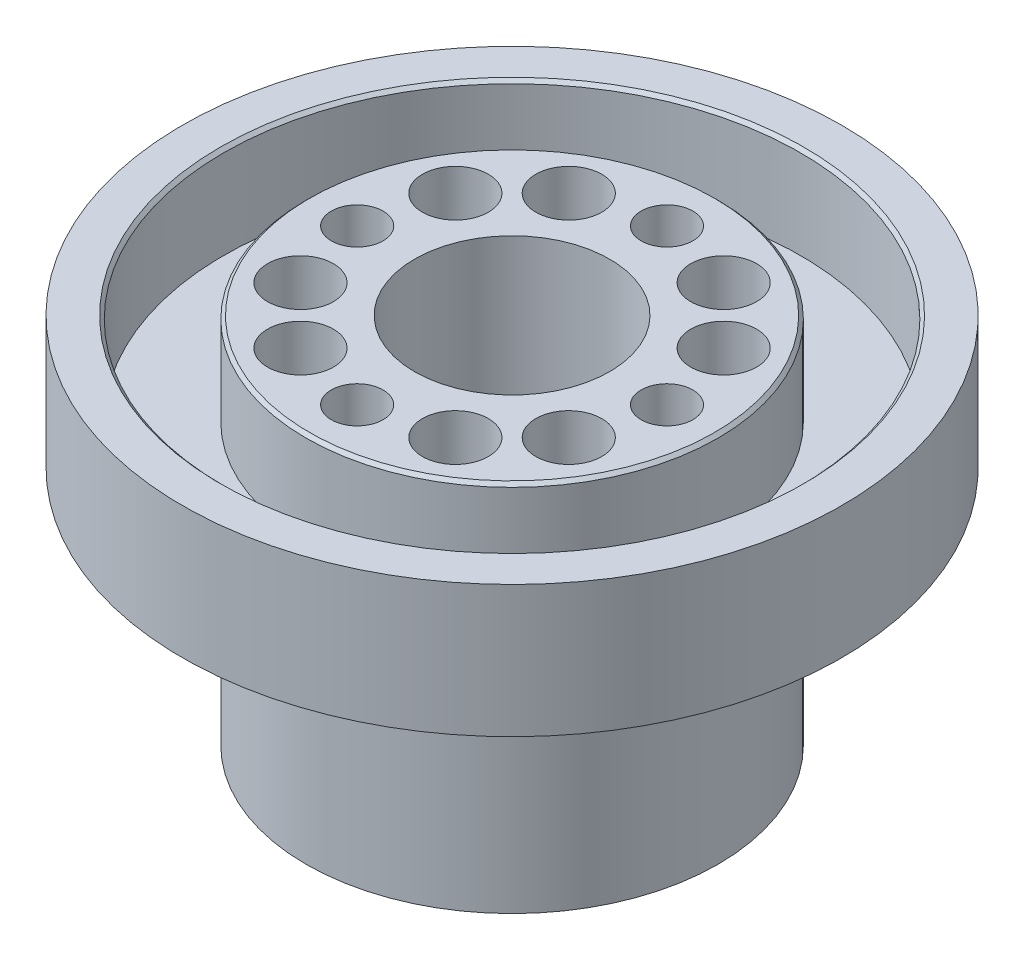
ISO-10303-21;
HEADER;
FILE_DESCRIPTION(('STEP AP214'),'2;1');
FILE_NAME('part.step','',(''),(''),'','','');
FILE_SCHEMA(('AUTOMOTIVE_DESIGN { 1 0 10303 214 1 1 1 1 }'));
ENDSEC;
DATA;
#1=APPLICATION_CONTEXT('core data for automotive mechanical design processes');
#2=APPLICATION_PROTOCOL_DEFINITION('international standard','automotive_design',2000,#1);
#3=PRODUCT_CONTEXT('',#1,'mechanical');
#4=PRODUCT('Part','Part','',(#3));
#5=PRODUCT_RELATED_PRODUCT_CATEGORY('part','',(#4));
#6=PRODUCT_DEFINITION_FORMATION('','',#4);
#7=PRODUCT_DEFINITION_CONTEXT('part definition',#1,'design');
#8=PRODUCT_DEFINITION('design','',#6,#7);
#9=PRODUCT_DEFINITION_SHAPE('','',#8);
#10=(LENGTH_UNIT() NAMED_UNIT(*) SI_UNIT(.MILLI.,.METRE.));
#11=(NAMED_UNIT(*) PLANE_ANGLE_UNIT() SI_UNIT($,.RADIAN.));
#12=(NAMED_UNIT(*) SI_UNIT($,.STERADIAN.) SOLID_ANGLE_UNIT());
#13=UNCERTAINTY_MEASURE_WITH_UNIT(LENGTH_MEASURE(1.E-05),#10,'distance_accuracy_value','');
#14=(GEOMETRIC_REPRESENTATION_CONTEXT(3) GLOBAL_UNCERTAINTY_ASSIGNED_CONTEXT((#13)) GLOBAL_UNIT_ASSIGNED_CONTEXT((#10,
#11,#12)) REPRESENTATION_CONTEXT('',''));
#15=CARTESIAN_POINT('',(0.,0.,0.));
#16=DIRECTION('',(0.,0.,1.));
#17=DIRECTION('',(1.,0.,0.));
#18=AXIS2_PLACEMENT_3D('',#15,#16,#17);
#19=CARTESIAN_POINT('',(0.,16.51,0.));
#20=DIRECTION('',(0.,1.,0.));
#21=DIRECTION('',(0.,0.,1.));
#22=AXIS2_PLACEMENT_3D('',#19,#20,#21);
#23=CYLINDRICAL_SURFACE('',#22,7.5184);
#24=CARTESIAN_POINT('',(0.,28.702,0.));
#25=DIRECTION('',(0.,1.,0.));
#26=DIRECTION('',(0.,0.,1.));
#27=AXIS2_PLACEMENT_3D('',#24,#25,#26);
#28=CIRCLE('',#27,7.5184);
#29=CARTESIAN_POINT('',(0.,28.702,7.5184));
#30=VERTEX_POINT('',#29);
#31=EDGE_CURVE('E131',#30,#30,#28,.F.);
#32=ORIENTED_EDGE('',*,*,#31,.F.);
#33=EDGE_LOOP('',(#32));
#34=FACE_BOUND('',#33,.T.);
#35=CARTESIAN_POINT('',(0.,16.51,0.));
#36=DIRECTION('',(0.,1.,0.));
#37=DIRECTION('',(0.,0.,1.));
#38=AXIS2_PLACEMENT_3D('',#35,#36,#37);
#39=CIRCLE('',#38,7.5184);
#40=CARTESIAN_POINT('',(0.,16.51,7.5184));
#41=VERTEX_POINT('',#40);
#42=EDGE_CURVE('E17',#41,#41,#39,.T.);
#43=ORIENTED_EDGE('',*,*,#42,.F.);
#44=EDGE_LOOP('',(#43));
#45=FACE_BOUND('',#44,.T.);
#46=ADVANCED_FACE('F14',(#34,#45),#23,.F.);
#47=CARTESIAN_POINT('',(0.,28.448,0.));
#48=DIRECTION('',(0.,-1.,0.));
#49=DIRECTION('',(0.,0.,-1.));
#50=AXIS2_PLACEMENT_3D('',#47,#48,#49);
#51=CONICAL_SURFACE('',#50,15.875,0.785398163397448);
#52=CARTESIAN_POINT('',(0.,28.702,0.));
#53=DIRECTION('',(0.,-1.,0.));
#54=DIRECTION('',(0.,0.,-1.));
#55=AXIS2_PLACEMENT_3D('',#52,#53,#54);
#56=CIRCLE('',#55,15.621);
#57=CARTESIAN_POINT('',(0.,28.702,-15.621));
#58=VERTEX_POINT('',#57);
#59=EDGE_CURVE('E133',#58,#58,#56,.F.);
#60=ORIENTED_EDGE('',*,*,#59,.F.);
#61=EDGE_LOOP('',(#60));
#62=FACE_BOUND('',#61,.T.);
#63=CARTESIAN_POINT('',(0.,28.448,0.));
#64=DIRECTION('',(0.,1.,0.));
#65=DIRECTION('',(0.,0.,1.));
#66=AXIS2_PLACEMENT_3D('',#63,#64,#65);
#67=CIRCLE('',#66,15.875);
#68=CARTESIAN_POINT('',(0.,28.448,15.875));
#69=VERTEX_POINT('',#68);
#70=EDGE_CURVE('E29',#69,#69,#67,.F.);
#71=ORIENTED_EDGE('',*,*,#70,.F.);
#72=EDGE_LOOP('',(#71));
#73=FACE_BOUND('',#72,.T.);
#74=ADVANCED_FACE('F144',(#62,#73),#51,.T.);
#75=CARTESIAN_POINT('',(0.,16.51,0.));
#76=DIRECTION('',(0.,1.,0.));
#77=DIRECTION('',(0.,0.,1.));
#78=AXIS2_PLACEMENT_3D('',#75,#76,#77);
#79=PLANE('',#78);
#80=ORIENTED_EDGE('',*,*,#42,.T.);
#81=EDGE_LOOP('',(#80));
#82=FACE_BOUND('',#81,.T.);
#83=CARTESIAN_POINT('',(0.,16.51,0.));
#84=DIRECTION('',(0.,-1.,0.));
#85=DIRECTION('',(0.,0.,-1.));
#86=AXIS2_PLACEMENT_3D('',#83,#84,#85);
#87=CIRCLE('',#86,6.985);
#88=CARTESIAN_POINT('',(0.,16.51,-6.985));
#89=VERTEX_POINT('',#88);
#90=EDGE_CURVE('E104',#89,#89,#87,.T.);
#91=ORIENTED_EDGE('',*,*,#90,.T.);
#92=EDGE_LOOP('',(#91));
#93=FACE_BOUND('',#92,.T.);
#94=ADVANCED_FACE('F140',(#82,#93),#79,.T.);
#95=CARTESIAN_POINT('',(0.,28.702,0.));
#96=DIRECTION('',(0.,1.,0.));
#97=DIRECTION('',(0.,0.,1.));
#98=AXIS2_PLACEMENT_3D('',#95,#96,#97);
#99=PLANE('',#98);
#100=CARTESIAN_POINT('',(-10.3386112703787,28.702,5.96899999999994));
#101=DIRECTION('',(0.,-1.,0.));
#102=DIRECTION('',(0.,0.,-1.));
#103=AXIS2_PLACEMENT_3D('',#100,#101,#102);
#104=CIRCLE('',#103,2.54);
#105=CARTESIAN_POINT('',(-10.3386112703787,28.702,3.42899999999993));
#106=VERTEX_POINT('',#105);
#107=EDGE_CURVE('E128',#106,#106,#104,.T.);
#108=ORIENTED_EDGE('',*,*,#107,.T.);
#109=EDGE_LOOP('',(#108));
#110=FACE_BOUND('',#109,.T.);
#111=CARTESIAN_POINT('',(-5.96900000000012,28.702,10.3386112703786));
#112=DIRECTION('',(0.,-1.,0.));
#113=DIRECTION('',(0.,0.,-1.));
#114=AXIS2_PLACEMENT_3D('',#111,#112,#113);
#115=CIRCLE('',#114,2.54);
#116=CARTESIAN_POINT('',(-5.96900000000012,28.702,7.79861127037856));
#117=VERTEX_POINT('',#116);
#118=EDGE_CURVE('E125',#117,#117,#115,.T.);
#119=ORIENTED_EDGE('',*,*,#118,.T.);
#120=EDGE_LOOP('',(#119));
#121=FACE_BOUND('',#120,.T.);
#122=CARTESIAN_POINT('',(5.96900000000004,28.702,10.3386112703786));
#123=DIRECTION('',(0.,-1.,0.));
#124=DIRECTION('',(0.,0.,-1.));
#125=AXIS2_PLACEMENT_3D('',#122,#123,#124);
#126=CIRCLE('',#125,2.54);
#127=CARTESIAN_POINT('',(5.96900000000004,28.702,7.7986112703786));
#128=VERTEX_POINT('',#127);
#129=EDGE_CURVE('E122',#128,#128,#126,.T.);
#130=ORIENTED_EDGE('',*,*,#129,.T.);
#131=EDGE_LOOP('',(#130));
#132=FACE_BOUND('',#131,.T.);
#133=CARTESIAN_POINT('',(10.3386112703786,28.702,5.96900000000002));
#134=DIRECTION('',(0.,-1.,0.));
#135=DIRECTION('',(0.,0.,-1.));
#136=AXIS2_PLACEMENT_3D('',#133,#134,#135);
#137=CIRCLE('',#136,2.54);
#138=CARTESIAN_POINT('',(10.3386112703786,28.702,3.42900000000001));
#139=VERTEX_POINT('',#138);
#140=EDGE_CURVE('E119',#139,#139,#137,.T.);
#141=ORIENTED_EDGE('',*,*,#140,.T.);
#142=EDGE_LOOP('',(#141));
#143=FACE_BOUND('',#142,.T.);
#144=CARTESIAN_POINT('',(10.3386112703786,28.702,-5.96900000000001));
#145=DIRECTION('',(0.,-1.,0.));
#146=DIRECTION('',(0.,0.,-1.));
#147=AXIS2_PLACEMENT_3D('',#144,#145,#146);
#148=CIRCLE('',#147,2.54);
#149=CARTESIAN_POINT('',(10.3386112703786,28.702,-8.50900000000001));
#150=VERTEX_POINT('',#149);
#151=EDGE_CURVE('E116',#150,#150,#148,.T.);
#152=ORIENTED_EDGE('',*,*,#151,.T.);
#153=EDGE_LOOP('',(#152));
#154=FACE_BOUND('',#153,.T.);
#155=CARTESIAN_POINT('',(5.96900000000005,28.702,-10.3386112703786));
#156=DIRECTION('',(0.,-1.,0.));
#157=DIRECTION('',(0.,0.,-1.));
#158=AXIS2_PLACEMENT_3D('',#155,#156,#157);
#159=CIRCLE('',#158,2.54);
#160=CARTESIAN_POINT('',(5.96900000000005,28.702,-12.8786112703786));
#161=VERTEX_POINT('',#160);
#162=EDGE_CURVE('E113',#161,#161,#159,.T.);
#163=ORIENTED_EDGE('',*,*,#162,.T.);
#164=EDGE_LOOP('',(#163));
#165=FACE_BOUND('',#164,.T.);
#166=CARTESIAN_POINT('',(-5.96900000000004,28.702,-10.3386112703786));
#167=DIRECTION('',(0.,-1.,0.));
#168=DIRECTION('',(0.,0.,-1.));
#169=AXIS2_PLACEMENT_3D('',#166,#167,#168);
#170=CIRCLE('',#169,2.54);
#171=CARTESIAN_POINT('',(-5.96900000000004,28.702,-12.8786112703786));
#172=VERTEX_POINT('',#171);
#173=EDGE_CURVE('E110',#172,#172,#170,.T.);
#174=ORIENTED_EDGE('',*,*,#173,.T.);
#175=EDGE_LOOP('',(#174));
#176=FACE_BOUND('',#175,.T.);
#177=CARTESIAN_POINT('',(-10.3386112703786,28.702,-5.96900000000002));
#178=DIRECTION('',(0.,-1.,0.));
#179=DIRECTION('',(0.,0.,-1.));
#180=AXIS2_PLACEMENT_3D('',#177,#178,#179);
#181=CIRCLE('',#180,2.54);
#182=CARTESIAN_POINT('',(-10.3386112703786,28.702,-8.50900000000002));
#183=VERTEX_POINT('',#182);
#184=EDGE_CURVE('E107',#183,#183,#181,.T.);
#185=ORIENTED_EDGE('',*,*,#184,.T.);
#186=EDGE_LOOP('',(#185));
#187=FACE_BOUND('',#186,.T.);
#188=ORIENTED_EDGE('',*,*,#31,.T.);
#189=EDGE_LOOP('',(#188));
#190=FACE_BOUND('',#189,.T.);
#191=CARTESIAN_POINT('',(-11.938,28.702,-1.25043912669328E-13));
#192=DIRECTION('',(0.,1.,0.));
#193=DIRECTION('',(0.,0.,1.));
#194=AXIS2_PLACEMENT_3D('',#191,#192,#193);
#195=CIRCLE('',#194,1.9939);
#196=CARTESIAN_POINT('',(-11.938,28.702,1.99389999999988));
#197=VERTEX_POINT('',#196);
#198=EDGE_CURVE('E92',#197,#197,#195,.F.);
#199=ORIENTED_EDGE('',*,*,#198,.T.);
#200=EDGE_LOOP('',(#199));
#201=FACE_BOUND('',#200,.T.);
#202=CARTESIAN_POINT('',(0.,28.702,11.938));
#203=DIRECTION('',(0.,1.,0.));
#204=DIRECTION('',(0.,0.,1.));
#205=AXIS2_PLACEMENT_3D('',#202,#203,#204);
#206=CIRCLE('',#205,1.9939);
#207=CARTESIAN_POINT('',(0.,28.702,13.9319));
#208=VERTEX_POINT('',#207);
#209=EDGE_CURVE('E95',#208,#208,#206,.F.);
#210=ORIENTED_EDGE('',*,*,#209,.T.);
#211=EDGE_LOOP('',(#210));
#212=FACE_BOUND('',#211,.T.);
#213=CARTESIAN_POINT('',(11.938,28.702,0.));
#214=DIRECTION('',(0.,1.,0.));
#215=DIRECTION('',(0.,0.,1.));
#216=AXIS2_PLACEMENT_3D('',#213,#214,#215);
#217=CIRCLE('',#216,1.9939);
#218=CARTESIAN_POINT('',(11.938,28.702,1.99390000000004));
#219=VERTEX_POINT('',#218);
#220=EDGE_CURVE('E98',#219,#219,#217,.F.);
#221=ORIENTED_EDGE('',*,*,#220,.T.);
#222=EDGE_LOOP('',(#221));
#223=FACE_BOUND('',#222,.T.);
#224=CARTESIAN_POINT('',(0.,28.702,-11.938));
#225=DIRECTION('',(0.,1.,0.));
#226=DIRECTION('',(0.,0.,1.));
#227=AXIS2_PLACEMENT_3D('',#224,#225,#226);
#228=CIRCLE('',#227,1.9939);
#229=CARTESIAN_POINT('',(0.,28.702,-9.9441));
#230=VERTEX_POINT('',#229);
#231=EDGE_CURVE('E101',#230,#230,#228,.F.);
#232=ORIENTED_EDGE('',*,*,#231,.T.);
#233=EDGE_LOOP('',(#232));
#234=FACE_BOUND('',#233,.T.);
#235=ORIENTED_EDGE('',*,*,#59,.T.);
#236=EDGE_LOOP('',(#235));
#237=FACE_BOUND('',#236,.T.);
#238=ADVANCED_FACE('F251',(#110,#121,#132,#143,#154,#165,#176,#187,#190,#201,#212,#223,#234,
#237),#99,.T.);
#239=CARTESIAN_POINT('',(0.,21.59,0.));
#240=DIRECTION('',(0.,1.,0.));
#241=DIRECTION('',(0.,0.,1.));
#242=AXIS2_PLACEMENT_3D('',#239,#240,#241);
#243=CYLINDRICAL_SURFACE('',#242,15.875);
#244=CARTESIAN_POINT('',(0.,21.59,0.));
#245=DIRECTION('',(0.,1.,0.));
#246=DIRECTION('',(0.,0.,1.));
#247=AXIS2_PLACEMENT_3D('',#244,#245,#246);
#248=CIRCLE('',#247,15.875);
#249=CARTESIAN_POINT('',(0.,21.59,15.875));
#250=VERTEX_POINT('',#249);
#251=EDGE_CURVE('E89',#250,#250,#248,.F.);
#252=ORIENTED_EDGE('',*,*,#251,.F.);
#253=EDGE_LOOP('',(#252));
#254=FACE_BOUND('',#253,.T.);
#255=ORIENTED_EDGE('',*,*,#70,.T.);
#256=EDGE_LOOP('',(#255));
#257=FACE_BOUND('',#256,.T.);
#258=ADVANCED_FACE('F247',(#254,#257),#243,.T.);
#259=CARTESIAN_POINT('',(-10.3386112703787,28.702,5.96899999999994));
#260=DIRECTION('',(0.,-1.,0.));
#261=DIRECTION('',(0.,0.,-1.));
#262=AXIS2_PLACEMENT_3D('',#259,#260,#261);
#263=CYLINDRICAL_SURFACE('',#262,2.54);
#264=ORIENTED_EDGE('',*,*,#107,.F.);
#265=EDGE_LOOP('',(#264));
#266=FACE_BOUND('',#265,.T.);
#267=CARTESIAN_POINT('',(-10.3386112703787,0.,5.96899999999994));
#268=DIRECTION('',(0.,-1.,0.));
#269=DIRECTION('',(0.,0.,-1.));
#270=AXIS2_PLACEMENT_3D('',#267,#268,#269);
#271=CIRCLE('',#270,2.54);
#272=CARTESIAN_POINT('',(-10.3386112703787,0.,3.42899999999993));
#273=VERTEX_POINT('',#272);
#274=EDGE_CURVE('E86',#273,#273,#271,.T.);
#275=ORIENTED_EDGE('',*,*,#274,.T.);
#276=EDGE_LOOP('',(#275));
#277=FACE_BOUND('',#276,.T.);
#278=ADVANCED_FACE('F243',(#266,#277),#263,.F.);
#279=CARTESIAN_POINT('',(-5.96900000000012,28.702,10.3386112703786));
#280=DIRECTION('',(0.,-1.,0.));
#281=DIRECTION('',(0.,0.,-1.));
#282=AXIS2_PLACEMENT_3D('',#279,#280,#281);
#283=CYLINDRICAL_SURFACE('',#282,2.54);
#284=ORIENTED_EDGE('',*,*,#118,.F.);
#285=EDGE_LOOP('',(#284));
#286=FACE_BOUND('',#285,.T.);
#287=CARTESIAN_POINT('',(-5.96900000000012,0.,10.3386112703786));
#288=DIRECTION('',(0.,-1.,0.));
#289=DIRECTION('',(0.,0.,-1.));
#290=AXIS2_PLACEMENT_3D('',#287,#288,#289);
#291=CIRCLE('',#290,2.54);
#292=CARTESIAN_POINT('',(-5.96900000000012,0.,7.79861127037856));
#293=VERTEX_POINT('',#292);
#294=EDGE_CURVE('E83',#293,#293,#291,.T.);
#295=ORIENTED_EDGE('',*,*,#294,.T.);
#296=EDGE_LOOP('',(#295));
#297=FACE_BOUND('',#296,.T.);
#298=ADVANCED_FACE('F239',(#286,#297),#283,.F.);
#299=CARTESIAN_POINT('',(5.96900000000004,28.702,10.3386112703786));
#300=DIRECTION('',(0.,-1.,0.));
#301=DIRECTION('',(0.,0.,-1.));
#302=AXIS2_PLACEMENT_3D('',#299,#300,#301);
#303=CYLINDRICAL_SURFACE('',#302,2.54);
#304=ORIENTED_EDGE('',*,*,#129,.F.);
#305=EDGE_LOOP('',(#304));
#306=FACE_BOUND('',#305,.T.);
#307=CARTESIAN_POINT('',(5.96900000000004,0.,10.3386112703786));
#308=DIRECTION('',(0.,-1.,0.));
#309=DIRECTION('',(0.,0.,-1.));
#310=AXIS2_PLACEMENT_3D('',#307,#308,#309);
#311=CIRCLE('',#310,2.54);
#312=CARTESIAN_POINT('',(5.96900000000004,0.,7.7986112703786));
#313=VERTEX_POINT('',#312);
#314=EDGE_CURVE('E80',#313,#313,#311,.T.);
#315=ORIENTED_EDGE('',*,*,#314,.T.);
#316=EDGE_LOOP('',(#315));
#317=FACE_BOUND('',#316,.T.);
#318=ADVANCED_FACE('F235',(#306,#317),#303,.F.);
#319=CARTESIAN_POINT('',(10.3386112703786,28.702,5.96900000000002));
#320=DIRECTION('',(0.,-1.,0.));
#321=DIRECTION('',(0.,0.,-1.));
#322=AXIS2_PLACEMENT_3D('',#319,#320,#321);
#323=CYLINDRICAL_SURFACE('',#322,2.54);
#324=ORIENTED_EDGE('',*,*,#140,.F.);
#325=EDGE_LOOP('',(#324));
#326=FACE_BOUND('',#325,.T.);
#327=CARTESIAN_POINT('',(10.3386112703786,0.,5.96900000000002));
#328=DIRECTION('',(0.,-1.,0.));
#329=DIRECTION('',(0.,0.,-1.));
#330=AXIS2_PLACEMENT_3D('',#327,#328,#329);
#331=CIRCLE('',#330,2.54);
#332=CARTESIAN_POINT('',(10.3386112703786,0.,3.42900000000001));
#333=VERTEX_POINT('',#332);
#334=EDGE_CURVE('E77',#333,#333,#331,.T.);
#335=ORIENTED_EDGE('',*,*,#334,.T.);
#336=EDGE_LOOP('',(#335));
#337=FACE_BOUND('',#336,.T.);
#338=ADVANCED_FACE('F231',(#326,#337),#323,.F.);
#339=CARTESIAN_POINT('',(10.3386112703786,28.702,-5.96900000000001));
#340=DIRECTION('',(0.,-1.,0.));
#341=DIRECTION('',(0.,0.,-1.));
#342=AXIS2_PLACEMENT_3D('',#339,#340,#341);
#343=CYLINDRICAL_SURFACE('',#342,2.54);
#344=ORIENTED_EDGE('',*,*,#151,.F.);
#345=EDGE_LOOP('',(#344));
#346=FACE_BOUND('',#345,.T.);
#347=CARTESIAN_POINT('',(10.3386112703786,0.,-5.96900000000001));
#348=DIRECTION('',(0.,-1.,0.));
#349=DIRECTION('',(0.,0.,-1.));
#350=AXIS2_PLACEMENT_3D('',#347,#348,#349);
#351=CIRCLE('',#350,2.54);
#352=CARTESIAN_POINT('',(10.3386112703786,0.,-8.50900000000001));
#353=VERTEX_POINT('',#352);
#354=EDGE_CURVE('E74',#353,#353,#351,.T.);
#355=ORIENTED_EDGE('',*,*,#354,.T.);
#356=EDGE_LOOP('',(#355));
#357=FACE_BOUND('',#356,.T.);
#358=ADVANCED_FACE('F227',(#346,#357),#343,.F.);
#359=CARTESIAN_POINT('',(5.96900000000005,28.702,-10.3386112703786));
#360=DIRECTION('',(0.,-1.,0.));
#361=DIRECTION('',(0.,0.,-1.));
#362=AXIS2_PLACEMENT_3D('',#359,#360,#361);
#363=CYLINDRICAL_SURFACE('',#362,2.54);
#364=ORIENTED_EDGE('',*,*,#162,.F.);
#365=EDGE_LOOP('',(#364));
#366=FACE_BOUND('',#365,.T.);
#367=CARTESIAN_POINT('',(5.96900000000005,0.,-10.3386112703786));
#368=DIRECTION('',(0.,-1.,0.));
#369=DIRECTION('',(0.,0.,-1.));
#370=AXIS2_PLACEMENT_3D('',#367,#368,#369);
#371=CIRCLE('',#370,2.54);
#372=CARTESIAN_POINT('',(5.96900000000005,0.,-12.8786112703786));
#373=VERTEX_POINT('',#372);
#374=EDGE_CURVE('E71',#373,#373,#371,.T.);
#375=ORIENTED_EDGE('',*,*,#374,.T.);
#376=EDGE_LOOP('',(#375));
#377=FACE_BOUND('',#376,.T.);
#378=ADVANCED_FACE('F223',(#366,#377),#363,.F.);
#379=CARTESIAN_POINT('',(-5.96900000000004,28.702,-10.3386112703786));
#380=DIRECTION('',(0.,-1.,0.));
#381=DIRECTION('',(0.,0.,-1.));
#382=AXIS2_PLACEMENT_3D('',#379,#380,#381);
#383=CYLINDRICAL_SURFACE('',#382,2.54);
#384=ORIENTED_EDGE('',*,*,#173,.F.);
#385=EDGE_LOOP('',(#384));
#386=FACE_BOUND('',#385,.T.);
#387=CARTESIAN_POINT('',(-5.96900000000004,0.,-10.3386112703786));
#388=DIRECTION('',(0.,-1.,0.));
#389=DIRECTION('',(0.,0.,-1.));
#390=AXIS2_PLACEMENT_3D('',#387,#388,#389);
#391=CIRCLE('',#390,2.54);
#392=CARTESIAN_POINT('',(-5.96900000000004,0.,-12.8786112703786));
#393=VERTEX_POINT('',#392);
#394=EDGE_CURVE('E68',#393,#393,#391,.T.);
#395=ORIENTED_EDGE('',*,*,#394,.T.);
#396=EDGE_LOOP('',(#395));
#397=FACE_BOUND('',#396,.T.);
#398=ADVANCED_FACE('F219',(#386,#397),#383,.F.);
#399=CARTESIAN_POINT('',(-10.3386112703786,28.702,-5.96900000000002));
#400=DIRECTION('',(0.,-1.,0.));
#401=DIRECTION('',(0.,0.,-1.));
#402=AXIS2_PLACEMENT_3D('',#399,#400,#401);
#403=CYLINDRICAL_SURFACE('',#402,2.54);
#404=ORIENTED_EDGE('',*,*,#184,.F.);
#405=EDGE_LOOP('',(#404));
#406=FACE_BOUND('',#405,.T.);
#407=CARTESIAN_POINT('',(-10.3386112703786,0.,-5.96900000000002));
#408=DIRECTION('',(0.,-1.,0.));
#409=DIRECTION('',(0.,0.,-1.));
#410=AXIS2_PLACEMENT_3D('',#407,#408,#409);
#411=CIRCLE('',#410,2.54);
#412=CARTESIAN_POINT('',(-10.3386112703786,0.,-8.50900000000002));
#413=VERTEX_POINT('',#412);
#414=EDGE_CURVE('E65',#413,#413,#411,.T.);
#415=ORIENTED_EDGE('',*,*,#414,.T.);
#416=EDGE_LOOP('',(#415));
#417=FACE_BOUND('',#416,.T.);
#418=ADVANCED_FACE('F215',(#406,#417),#403,.F.);
#419=CARTESIAN_POINT('',(0.,28.702,0.));
#420=DIRECTION('',(0.,-1.,0.));
#421=DIRECTION('',(0.,0.,-1.));
#422=AXIS2_PLACEMENT_3D('',#419,#420,#421);
#423=CYLINDRICAL_SURFACE('',#422,6.985);
#424=CARTESIAN_POINT('',(0.,0.,0.));
#425=DIRECTION('',(0.,-1.,0.));
#426=DIRECTION('',(0.,0.,-1.));
#427=AXIS2_PLACEMENT_3D('',#424,#425,#426);
#428=CIRCLE('',#427,6.985);
#429=CARTESIAN_POINT('',(0.,0.,-6.985));
#430=VERTEX_POINT('',#429);
#431=EDGE_CURVE('E62',#430,#430,#428,.T.);
#432=ORIENTED_EDGE('',*,*,#431,.T.);
#433=EDGE_LOOP('',(#432));
#434=FACE_BOUND('',#433,.T.);
#435=ORIENTED_EDGE('',*,*,#90,.F.);
#436=EDGE_LOOP('',(#435));
#437=FACE_BOUND('',#436,.T.);
#438=ADVANCED_FACE('F211',(#434,#437),#423,.F.);
#439=CARTESIAN_POINT('',(0.,0.,-11.938));
#440=DIRECTION('',(0.,1.,0.));
#441=DIRECTION('',(0.,0.,1.));
#442=AXIS2_PLACEMENT_3D('',#439,#440,#441);
#443=CYLINDRICAL_SURFACE('',#442,1.9939);
#444=CARTESIAN_POINT('',(0.,0.,-11.938));
#445=DIRECTION('',(0.,1.,0.));
#446=DIRECTION('',(0.,0.,1.));
#447=AXIS2_PLACEMENT_3D('',#444,#445,#446);
#448=CIRCLE('',#447,1.9939);
#449=CARTESIAN_POINT('',(0.,0.,-9.9441));
#450=VERTEX_POINT('',#449);
#451=EDGE_CURVE('E59',#450,#450,#448,.F.);
#452=ORIENTED_EDGE('',*,*,#451,.T.);
#453=EDGE_LOOP('',(#452));
#454=FACE_BOUND('',#453,.T.);
#455=ORIENTED_EDGE('',*,*,#231,.F.);
#456=EDGE_LOOP('',(#455));
#457=FACE_BOUND('',#456,.T.);
#458=ADVANCED_FACE('F207',(#454,#457),#443,.F.);
#459=CARTESIAN_POINT('',(11.938,0.,0.));
#460=DIRECTION('',(0.,1.,0.));
#461=DIRECTION('',(0.,0.,1.));
#462=AXIS2_PLACEMENT_3D('',#459,#460,#461);
#463=CYLINDRICAL_SURFACE('',#462,1.9939);
#464=CARTESIAN_POINT('',(11.938,0.,0.));
#465=DIRECTION('',(0.,1.,0.));
#466=DIRECTION('',(0.,0.,1.));
#467=AXIS2_PLACEMENT_3D('',#464,#465,#466);
#468=CIRCLE('',#467,1.9939);
#469=CARTESIAN_POINT('',(11.938,0.,1.99390000000004));
#470=VERTEX_POINT('',#469);
#471=EDGE_CURVE('E56',#470,#470,#468,.F.);
#472=ORIENTED_EDGE('',*,*,#471,.T.);
#473=EDGE_LOOP('',(#472));
#474=FACE_BOUND('',#473,.T.);
#475=ORIENTED_EDGE('',*,*,#220,.F.);
#476=EDGE_LOOP('',(#475));
#477=FACE_BOUND('',#476,.T.);
#478=ADVANCED_FACE('F203',(#474,#477),#463,.F.);
#479=CARTESIAN_POINT('',(0.,0.,11.938));
#480=DIRECTION('',(0.,1.,0.));
#481=DIRECTION('',(0.,0.,1.));
#482=AXIS2_PLACEMENT_3D('',#479,#480,#481);
#483=CYLINDRICAL_SURFACE('',#482,1.9939);
#484=CARTESIAN_POINT('',(0.,0.,11.938));
#485=DIRECTION('',(0.,1.,0.));
#486=DIRECTION('',(0.,0.,1.));
#487=AXIS2_PLACEMENT_3D('',#484,#485,#486);
#488=CIRCLE('',#487,1.9939);
#489=CARTESIAN_POINT('',(0.,0.,13.9319));
#490=VERTEX_POINT('',#489);
#491=EDGE_CURVE('E53',#490,#490,#488,.F.);
#492=ORIENTED_EDGE('',*,*,#491,.T.);
#493=EDGE_LOOP('',(#492));
#494=FACE_BOUND('',#493,.T.);
#495=ORIENTED_EDGE('',*,*,#209,.F.);
#496=EDGE_LOOP('',(#495));
#497=FACE_BOUND('',#496,.T.);
#498=ADVANCED_FACE('F199',(#494,#497),#483,.F.);
#499=CARTESIAN_POINT('',(-11.938,0.,-1.25043912669328E-13));
#500=DIRECTION('',(0.,1.,0.));
#501=DIRECTION('',(0.,0.,1.));
#502=AXIS2_PLACEMENT_3D('',#499,#500,#501);
#503=CYLINDRICAL_SURFACE('',#502,1.9939);
#504=CARTESIAN_POINT('',(-11.938,0.,-1.25043912669328E-13));
#505=DIRECTION('',(0.,1.,0.));
#506=DIRECTION('',(0.,0.,1.));
#507=AXIS2_PLACEMENT_3D('',#504,#505,#506);
#508=CIRCLE('',#507,1.9939);
#509=CARTESIAN_POINT('',(-11.938,0.,1.99389999999988));
#510=VERTEX_POINT('',#509);
#511=EDGE_CURVE('E50',#510,#510,#508,.F.);
#512=ORIENTED_EDGE('',*,*,#511,.T.);
#513=EDGE_LOOP('',(#512));
#514=FACE_BOUND('',#513,.T.);
#515=ORIENTED_EDGE('',*,*,#198,.F.);
#516=EDGE_LOOP('',(#515));
#517=FACE_BOUND('',#516,.T.);
#518=ADVANCED_FACE('F195',(#514,#517),#503,.F.);
#519=CARTESIAN_POINT('',(0.,21.59,0.));
#520=DIRECTION('',(0.,1.,0.));
#521=DIRECTION('',(0.,0.,1.));
#522=AXIS2_PLACEMENT_3D('',#519,#520,#521);
#523=PLANE('',#522);
#524=CARTESIAN_POINT('',(0.,21.59,0.));
#525=DIRECTION('',(0.,1.,0.));
#526=DIRECTION('',(0.,0.,1.));
#527=AXIS2_PLACEMENT_3D('',#524,#525,#526);
#528=CIRCLE('',#527,22.225);
#529=CARTESIAN_POINT('',(0.,21.59,22.225));
#530=VERTEX_POINT('',#529);
#531=EDGE_CURVE('E47',#530,#530,#528,.T.);
#532=ORIENTED_EDGE('',*,*,#531,.T.);
#533=EDGE_LOOP('',(#532));
#534=FACE_BOUND('',#533,.T.);
#535=ORIENTED_EDGE('',*,*,#251,.T.);
#536=EDGE_LOOP('',(#535));
#537=FACE_BOUND('',#536,.T.);
#538=ADVANCED_FACE('F191',(#534,#537),#523,.T.);
#539=CARTESIAN_POINT('',(0.,0.,0.));
#540=DIRECTION('',(0.,1.,0.));
#541=DIRECTION('',(0.,0.,1.));
#542=AXIS2_PLACEMENT_3D('',#539,#540,#541);
#543=PLANE('',#542);
#544=CARTESIAN_POINT('',(0.,0.,0.));
#545=DIRECTION('',(0.,-1.,0.));
#546=DIRECTION('',(0.,0.,-1.));
#547=AXIS2_PLACEMENT_3D('',#544,#545,#546);
#548=CIRCLE('',#547,15.875);
#549=CARTESIAN_POINT('',(0.,0.,-15.875));
#550=VERTEX_POINT('',#549);
#551=EDGE_CURVE('E44',#550,#550,#548,.F.);
#552=ORIENTED_EDGE('',*,*,#551,.F.);
#553=EDGE_LOOP('',(#552));
#554=FACE_BOUND('',#553,.T.);
#555=ORIENTED_EDGE('',*,*,#511,.F.);
#556=EDGE_LOOP('',(#555));
#557=FACE_BOUND('',#556,.T.);
#558=ORIENTED_EDGE('',*,*,#491,.F.);
#559=EDGE_LOOP('',(#558));
#560=FACE_BOUND('',#559,.T.);
#561=ORIENTED_EDGE('',*,*,#471,.F.);
#562=EDGE_LOOP('',(#561));
#563=FACE_BOUND('',#562,.T.);
#564=ORIENTED_EDGE('',*,*,#451,.F.);
#565=EDGE_LOOP('',(#564));
#566=FACE_BOUND('',#565,.T.);
#567=ORIENTED_EDGE('',*,*,#431,.F.);
#568=EDGE_LOOP('',(#567));
#569=FACE_BOUND('',#568,.T.);
#570=ORIENTED_EDGE('',*,*,#414,.F.);
#571=EDGE_LOOP('',(#570));
#572=FACE_BOUND('',#571,.T.);
#573=ORIENTED_EDGE('',*,*,#394,.F.);
#574=EDGE_LOOP('',(#573));
#575=FACE_BOUND('',#574,.T.);
#576=ORIENTED_EDGE('',*,*,#374,.F.);
#577=EDGE_LOOP('',(#576));
#578=FACE_BOUND('',#577,.T.);
#579=ORIENTED_EDGE('',*,*,#354,.F.);
#580=EDGE_LOOP('',(#579));
#581=FACE_BOUND('',#580,.T.);
#582=ORIENTED_EDGE('',*,*,#334,.F.);
#583=EDGE_LOOP('',(#582));
#584=FACE_BOUND('',#583,.T.);
#585=ORIENTED_EDGE('',*,*,#314,.F.);
#586=EDGE_LOOP('',(#585));
#587=FACE_BOUND('',#586,.T.);
#588=ORIENTED_EDGE('',*,*,#294,.F.);
#589=EDGE_LOOP('',(#588));
#590=FACE_BOUND('',#589,.T.);
#591=ORIENTED_EDGE('',*,*,#274,.F.);
#592=EDGE_LOOP('',(#591));
#593=FACE_BOUND('',#592,.T.);
#594=ADVANCED_FACE('F187',(#554,#557,#560,#563,#566,#569,#572,#575,#578,#581,#584,#587,#590,
#593),#543,.F.);
#595=CARTESIAN_POINT('',(0.,21.59,0.));
#596=DIRECTION('',(0.,1.,0.));
#597=DIRECTION('',(0.,0.,1.));
#598=AXIS2_PLACEMENT_3D('',#595,#596,#597);
#599=CYLINDRICAL_SURFACE('',#598,22.225);
#600=ORIENTED_EDGE('',*,*,#531,.F.);
#601=EDGE_LOOP('',(#600));
#602=FACE_BOUND('',#601,.T.);
#603=CARTESIAN_POINT('',(0.,28.448,0.));
#604=DIRECTION('',(0.,1.,0.));
#605=DIRECTION('',(0.,0.,1.));
#606=AXIS2_PLACEMENT_3D('',#603,#604,#605);
#607=CIRCLE('',#606,22.225);
#608=CARTESIAN_POINT('',(0.,28.448,22.225));
#609=VERTEX_POINT('',#608);
#610=EDGE_CURVE('E43',#609,#609,#607,.T.);
#611=ORIENTED_EDGE('',*,*,#610,.T.);
#612=EDGE_LOOP('',(#611));
#613=FACE_BOUND('',#612,.T.);
#614=ADVANCED_FACE('F183',(#602,#613),#599,.F.);
#615=CARTESIAN_POINT('',(0.,17.78,0.));
#616=DIRECTION('',(0.,-1.,0.));
#617=DIRECTION('',(0.,0.,-1.));
#618=AXIS2_PLACEMENT_3D('',#615,#616,#617);
#619=CYLINDRICAL_SURFACE('',#618,15.875);
#620=CARTESIAN_POINT('',(0.,17.78,0.));
#621=DIRECTION('',(0.,-1.,0.));
#622=DIRECTION('',(0.,0.,-1.));
#623=AXIS2_PLACEMENT_3D('',#620,#621,#622);
#624=CIRCLE('',#623,15.875);
#625=CARTESIAN_POINT('',(0.,17.78,-15.875));
#626=VERTEX_POINT('',#625);
#627=EDGE_CURVE('E40',#626,#626,#624,.F.);
#628=ORIENTED_EDGE('',*,*,#627,.F.);
#629=EDGE_LOOP('',(#628));
#630=FACE_BOUND('',#629,.T.);
#631=ORIENTED_EDGE('',*,*,#551,.T.);
#632=EDGE_LOOP('',(#631));
#633=FACE_BOUND('',#632,.T.);
#634=ADVANCED_FACE('F179',(#630,#633),#619,.T.);
#635=CARTESIAN_POINT('',(0.,28.702,0.));
#636=DIRECTION('',(0.,1.,0.));
#637=DIRECTION('',(-1.,0.,0.));
#638=AXIS2_PLACEMENT_3D('',#635,#636,#637);
#639=CONICAL_SURFACE('',#638,22.479,0.785398163397448);
#640=ORIENTED_EDGE('',*,*,#610,.F.);
#641=EDGE_LOOP('',(#640));
#642=FACE_BOUND('',#641,.T.);
#643=CARTESIAN_POINT('',(0.,28.702,0.));
#644=DIRECTION('',(0.,1.,0.));
#645=DIRECTION('',(-1.,0.,0.));
#646=AXIS2_PLACEMENT_3D('',#643,#644,#645);
#647=CIRCLE('',#646,22.479);
#648=CARTESIAN_POINT('',(-22.479,28.702,0.));
#649=VERTEX_POINT('',#648);
#650=EDGE_CURVE('E37',#649,#649,#647,.F.);
#651=ORIENTED_EDGE('',*,*,#650,.F.);
#652=EDGE_LOOP('',(#651));
#653=FACE_BOUND('',#652,.T.);
#654=ADVANCED_FACE('F175',(#642,#653),#639,.F.);
#655=CARTESIAN_POINT('',(0.,17.78,0.));
#656=DIRECTION('',(0.,-1.,0.));
#657=DIRECTION('',(0.,0.,-1.));
#658=AXIS2_PLACEMENT_3D('',#655,#656,#657);
#659=PLANE('',#658);
#660=CARTESIAN_POINT('',(0.,17.78,0.));
#661=DIRECTION('',(0.,-1.,0.));
#662=DIRECTION('',(0.,0.,-1.));
#663=AXIS2_PLACEMENT_3D('',#660,#661,#662);
#664=CIRCLE('',#663,17.4625);
#665=CARTESIAN_POINT('',(0.,17.78,-17.4625));
#666=VERTEX_POINT('',#665);
#667=EDGE_CURVE('E34',#666,#666,#664,.F.);
#668=ORIENTED_EDGE('',*,*,#667,.F.);
#669=EDGE_LOOP('',(#668));
#670=FACE_BOUND('',#669,.T.);
#671=ORIENTED_EDGE('',*,*,#627,.T.);
#672=EDGE_LOOP('',(#671));
#673=FACE_BOUND('',#672,.T.);
#674=ADVANCED_FACE('F171',(#670,#673),#659,.T.);
#675=CARTESIAN_POINT('',(0.,28.702,0.));
#676=DIRECTION('',(0.,1.,0.));
#677=DIRECTION('',(0.,0.,1.));
#678=AXIS2_PLACEMENT_3D('',#675,#676,#677);
#679=PLANE('',#678);
#680=CARTESIAN_POINT('',(0.,28.702,0.));
#681=DIRECTION('',(0.,-1.,0.));
#682=DIRECTION('',(0.,0.,-1.));
#683=AXIS2_PLACEMENT_3D('',#680,#681,#682);
#684=CIRCLE('',#683,25.4);
#685=CARTESIAN_POINT('',(0.,28.702,-25.4));
#686=VERTEX_POINT('',#685);
#687=EDGE_CURVE('E26',#686,#686,#684,.T.);
#688=ORIENTED_EDGE('',*,*,#687,.F.);
#689=EDGE_LOOP('',(#688));
#690=FACE_BOUND('',#689,.T.);
#691=ORIENTED_EDGE('',*,*,#650,.T.);
#692=EDGE_LOOP('',(#691));
#693=FACE_BOUND('',#692,.T.);
#694=ADVANCED_FACE('F167',(#690,#693),#679,.T.);
#695=CARTESIAN_POINT('',(0.,18.542,0.));
#696=DIRECTION('',(0.,-1.,0.));
#697=DIRECTION('',(0.,0.,-1.));
#698=AXIS2_PLACEMENT_3D('',#695,#696,#697);
#699=CYLINDRICAL_SURFACE('',#698,17.4625);
#700=CARTESIAN_POINT('',(0.,18.542,0.));
#701=DIRECTION('',(0.,-1.,0.));
#702=DIRECTION('',(0.,0.,-1.));
#703=AXIS2_PLACEMENT_3D('',#700,#701,#702);
#704=CIRCLE('',#703,17.4625);
#705=CARTESIAN_POINT('',(0.,18.542,-17.4625));
#706=VERTEX_POINT('',#705);
#707=EDGE_CURVE('E21',#706,#706,#704,.F.);
#708=ORIENTED_EDGE('',*,*,#707,.F.);
#709=EDGE_LOOP('',(#708));
#710=FACE_BOUND('',#709,.T.);
#711=ORIENTED_EDGE('',*,*,#667,.T.);
#712=EDGE_LOOP('',(#711));
#713=FACE_BOUND('',#712,.T.);
#714=ADVANCED_FACE('F160',(#710,#713),#699,.T.);
#715=CARTESIAN_POINT('',(0.,28.702,0.));
#716=DIRECTION('',(0.,-1.,0.));
#717=DIRECTION('',(0.,0.,-1.));
#718=AXIS2_PLACEMENT_3D('',#715,#716,#717);
#719=CYLINDRICAL_SURFACE('',#718,25.4);
#720=ORIENTED_EDGE('',*,*,#687,.T.);
#721=EDGE_LOOP('',(#720));
#722=FACE_BOUND('',#721,.T.);
#723=CARTESIAN_POINT('',(0.,18.542,0.));
#724=DIRECTION('',(0.,-1.,0.));
#725=DIRECTION('',(0.,0.,-1.));
#726=AXIS2_PLACEMENT_3D('',#723,#724,#725);
#727=CIRCLE('',#726,25.4);
#728=CARTESIAN_POINT('',(0.,18.542,-25.4));
#729=VERTEX_POINT('',#728);
#730=EDGE_CURVE('E10',#729,#729,#727,.T.);
#731=ORIENTED_EDGE('',*,*,#730,.F.);
#732=EDGE_LOOP('',(#731));
#733=FACE_BOUND('',#732,.T.);
#734=ADVANCED_FACE('F154',(#722,#733),#719,.T.);
#735=CARTESIAN_POINT('',(0.,18.542,0.));
#736=DIRECTION('',(0.,-1.,0.));
#737=DIRECTION('',(0.,0.,-1.));
#738=AXIS2_PLACEMENT_3D('',#735,#736,#737);
#739=PLANE('',#738);
#740=ORIENTED_EDGE('',*,*,#730,.T.);
#741=EDGE_LOOP('',(#740));
#742=FACE_BOUND('',#741,.T.);
#743=ORIENTED_EDGE('',*,*,#707,.T.);
#744=EDGE_LOOP('',(#743));
#745=FACE_BOUND('',#744,.T.);
#746=ADVANCED_FACE('F152',(#742,#745),#739,.T.);
#747=CLOSED_SHELL('',(#46,#74,#94,#238,#258,#278,#298,#318,#338,#358,#378,#398,#418,#438,#458,
#478,#498,#518,#538,#594,#614,#634,#654,#674,#694,#714,#734,#746));
#748=MANIFOLD_SOLID_BREP('B1',#747);
#749=ADVANCED_BREP_SHAPE_REPRESENTATION('',(#18,#748),#14);
#750=SHAPE_DEFINITION_REPRESENTATION(#9,#749);
ENDSEC;
END-ISO-10303-21;
